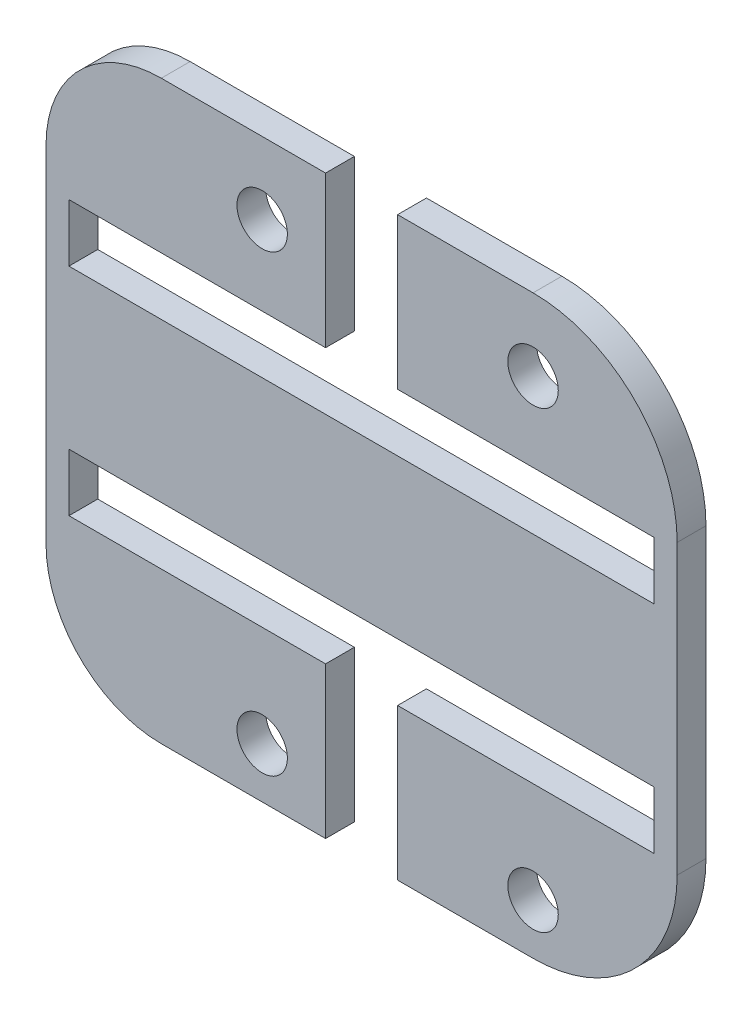
ISO-10303-21;
HEADER;
FILE_DESCRIPTION(('STEP AP214'),'2;1');
FILE_NAME('part.step','',(''),(''),'','','');
FILE_SCHEMA(('AUTOMOTIVE_DESIGN { 1 0 10303 214 1 1 1 1 }'));
ENDSEC;
DATA;
#1=APPLICATION_CONTEXT('core data for automotive mechanical design processes');
#2=APPLICATION_PROTOCOL_DEFINITION('international standard','automotive_design',2000,#1);
#3=PRODUCT_CONTEXT('',#1,'mechanical');
#4=PRODUCT('Part','Part','',(#3));
#5=PRODUCT_RELATED_PRODUCT_CATEGORY('part','',(#4));
#6=PRODUCT_DEFINITION_FORMATION('','',#4);
#7=PRODUCT_DEFINITION_CONTEXT('part definition',#1,'design');
#8=PRODUCT_DEFINITION('design','',#6,#7);
#9=PRODUCT_DEFINITION_SHAPE('','',#8);
#10=(LENGTH_UNIT() NAMED_UNIT(*) SI_UNIT(.MILLI.,.METRE.));
#11=(NAMED_UNIT(*) PLANE_ANGLE_UNIT() SI_UNIT($,.RADIAN.));
#12=(NAMED_UNIT(*) SI_UNIT($,.STERADIAN.) SOLID_ANGLE_UNIT());
#13=UNCERTAINTY_MEASURE_WITH_UNIT(LENGTH_MEASURE(1.E-05),#10,'distance_accuracy_value','');
#14=(GEOMETRIC_REPRESENTATION_CONTEXT(3) GLOBAL_UNCERTAINTY_ASSIGNED_CONTEXT((#13)) GLOBAL_UNIT_ASSIGNED_CONTEXT((#10,
#11,#12)) REPRESENTATION_CONTEXT('',''));
#15=CARTESIAN_POINT('',(0.,0.,0.));
#16=DIRECTION('',(0.,0.,1.));
#17=DIRECTION('',(1.,0.,0.));
#18=AXIS2_PLACEMENT_3D('',#15,#16,#17);
#19=CARTESIAN_POINT('',(0.,10.5,2.));
#20=DIRECTION('',(0.,1.,0.));
#21=DIRECTION('',(-1.,0.,0.));
#22=AXIS2_PLACEMENT_3D('',#19,#20,#21);
#23=PLANE('',#22);
#24=DIRECTION('',(1.,0.,0.));
#25=VECTOR('',#24,1.);
#26=CARTESIAN_POINT('',(0.,10.5,0.));
#27=LINE('',#26,#25);
#28=CARTESIAN_POINT('',(1.59,10.5,0.));
#29=VERTEX_POINT('',#28);
#30=CARTESIAN_POINT('',(19.4000000000001,10.5000000000001,0.));
#31=VERTEX_POINT('',#30);
#32=EDGE_CURVE('E201',#29,#31,#27,.T.);
#33=ORIENTED_EDGE('',*,*,#32,.F.);
#34=DIRECTION('',(0.,0.,-1.));
#35=VECTOR('',#34,1.);
#36=CARTESIAN_POINT('',(1.59,10.5,2.));
#37=LINE('',#36,#35);
#38=CARTESIAN_POINT('',(1.59,10.5,2.));
#39=VERTEX_POINT('',#38);
#40=EDGE_CURVE('E196',#39,#29,#37,.T.);
#41=ORIENTED_EDGE('',*,*,#40,.F.);
#42=DIRECTION('',(1.,0.,0.));
#43=VECTOR('',#42,1.);
#44=CARTESIAN_POINT('',(0.,10.5,2.));
#45=LINE('',#44,#43);
#46=CARTESIAN_POINT('',(19.4000000000001,10.5000000000001,2.));
#47=VERTEX_POINT('',#46);
#48=EDGE_CURVE('E199',#39,#47,#45,.T.);
#49=ORIENTED_EDGE('',*,*,#48,.T.);
#50=DIRECTION('',(0.,0.,-1.));
#51=VECTOR('',#50,1.);
#52=CARTESIAN_POINT('',(19.4000000000001,10.5000000000001,2.));
#53=LINE('',#52,#51);
#54=EDGE_CURVE('E269',#47,#31,#53,.T.);
#55=ORIENTED_EDGE('',*,*,#54,.T.);
#56=EDGE_LOOP('',(#33,#41,#49,#55));
#57=FACE_BOUND('',#56,.T.);
#58=ADVANCED_FACE('F35',(#57),#23,.T.);
#59=CARTESIAN_POINT('',(1.59,0.,2.));
#60=DIRECTION('',(-1.,0.,0.));
#61=DIRECTION('',(0.,-1.,0.));
#62=AXIS2_PLACEMENT_3D('',#59,#60,#61);
#63=PLANE('',#62);
#64=DIRECTION('',(0.,1.,0.));
#65=VECTOR('',#64,1.);
#66=CARTESIAN_POINT('',(1.59,0.,0.));
#67=LINE('',#66,#65);
#68=CARTESIAN_POINT('',(1.59,14.5,0.));
#69=VERTEX_POINT('',#68);
#70=EDGE_CURVE('E271',#29,#69,#67,.T.);
#71=ORIENTED_EDGE('',*,*,#70,.T.);
#72=DIRECTION('',(0.,0.,-1.));
#73=VECTOR('',#72,1.);
#74=CARTESIAN_POINT('',(1.59,14.5,2.));
#75=LINE('',#74,#73);
#76=CARTESIAN_POINT('',(1.59,14.5,2.));
#77=VERTEX_POINT('',#76);
#78=EDGE_CURVE('E205',#77,#69,#75,.T.);
#79=ORIENTED_EDGE('',*,*,#78,.F.);
#80=DIRECTION('',(0.,1.,0.));
#81=VECTOR('',#80,1.);
#82=CARTESIAN_POINT('',(1.59,0.,2.));
#83=LINE('',#82,#81);
#84=EDGE_CURVE('E208',#39,#77,#83,.T.);
#85=ORIENTED_EDGE('',*,*,#84,.F.);
#86=ORIENTED_EDGE('',*,*,#40,.T.);
#87=EDGE_LOOP('',(#71,#79,#85,#86));
#88=FACE_BOUND('',#87,.T.);
#89=ADVANCED_FACE('F209',(#88),#63,.F.);
#90=CARTESIAN_POINT('',(0.,14.5,2.));
#91=DIRECTION('',(0.,1.,0.));
#92=DIRECTION('',(0.,0.,1.));
#93=AXIS2_PLACEMENT_3D('',#90,#91,#92);
#94=PLANE('',#93);
#95=DIRECTION('',(1.,0.,0.));
#96=VECTOR('',#95,1.);
#97=CARTESIAN_POINT('',(0.,14.5,0.));
#98=LINE('',#97,#96);
#99=CARTESIAN_POINT('',(42.21,14.5,0.));
#100=VERTEX_POINT('',#99);
#101=EDGE_CURVE('E274',#69,#100,#98,.T.);
#102=ORIENTED_EDGE('',*,*,#101,.T.);
#103=DIRECTION('',(0.,0.,-1.));
#104=VECTOR('',#103,1.);
#105=CARTESIAN_POINT('',(42.21,14.5,2.));
#106=LINE('',#105,#104);
#107=CARTESIAN_POINT('',(42.21,14.5,2.));
#108=VERTEX_POINT('',#107);
#109=EDGE_CURVE('E347',#108,#100,#106,.T.);
#110=ORIENTED_EDGE('',*,*,#109,.F.);
#111=DIRECTION('',(1.,0.,0.));
#112=VECTOR('',#111,1.);
#113=CARTESIAN_POINT('',(0.,14.5,2.));
#114=LINE('',#113,#112);
#115=EDGE_CURVE('E212',#77,#108,#114,.T.);
#116=ORIENTED_EDGE('',*,*,#115,.F.);
#117=ORIENTED_EDGE('',*,*,#78,.T.);
#118=EDGE_LOOP('',(#102,#110,#116,#117));
#119=FACE_BOUND('',#118,.T.);
#120=ADVANCED_FACE('F466',(#119),#94,.F.);
#121=CARTESIAN_POINT('',(42.21,0.,2.));
#122=DIRECTION('',(-1.,0.,0.));
#123=DIRECTION('',(0.,0.,1.));
#124=AXIS2_PLACEMENT_3D('',#121,#122,#123);
#125=PLANE('',#124);
#126=DIRECTION('',(0.,1.,0.));
#127=VECTOR('',#126,1.);
#128=CARTESIAN_POINT('',(42.21,0.,0.));
#129=LINE('',#128,#127);
#130=CARTESIAN_POINT('',(42.21,10.5,0.));
#131=VERTEX_POINT('',#130);
#132=EDGE_CURVE('E277',#131,#100,#129,.T.);
#133=ORIENTED_EDGE('',*,*,#132,.F.);
#134=DIRECTION('',(0.,0.,-1.));
#135=VECTOR('',#134,1.);
#136=CARTESIAN_POINT('',(42.21,10.5,2.));
#137=LINE('',#136,#135);
#138=CARTESIAN_POINT('',(42.21,10.5,2.));
#139=VERTEX_POINT('',#138);
#140=EDGE_CURVE('E345',#139,#131,#137,.T.);
#141=ORIENTED_EDGE('',*,*,#140,.F.);
#142=DIRECTION('',(0.,1.,0.));
#143=VECTOR('',#142,1.);
#144=CARTESIAN_POINT('',(42.21,0.,2.));
#145=LINE('',#144,#143);
#146=EDGE_CURVE('E228',#139,#108,#145,.T.);
#147=ORIENTED_EDGE('',*,*,#146,.T.);
#148=ORIENTED_EDGE('',*,*,#109,.T.);
#149=EDGE_LOOP('',(#133,#141,#147,#148));
#150=FACE_BOUND('',#149,.T.);
#151=ADVANCED_FACE('F463',(#150),#125,.T.);
#152=CARTESIAN_POINT('',(0.,10.5000000000001,2.));
#153=DIRECTION('',(0.,1.,0.));
#154=DIRECTION('',(-1.,0.,0.));
#155=AXIS2_PLACEMENT_3D('',#152,#153,#154);
#156=PLANE('',#155);
#157=DIRECTION('',(1.,0.,0.));
#158=VECTOR('',#157,1.);
#159=CARTESIAN_POINT('',(0.,10.5000000000001,0.));
#160=LINE('',#159,#158);
#161=CARTESIAN_POINT('',(24.4000000000001,10.5000000000001,0.));
#162=VERTEX_POINT('',#161);
#163=EDGE_CURVE('E280',#162,#131,#160,.T.);
#164=ORIENTED_EDGE('',*,*,#163,.F.);
#165=DIRECTION('',(0.,0.,-1.));
#166=VECTOR('',#165,1.);
#167=CARTESIAN_POINT('',(24.4000000000001,10.5000000000001,2.));
#168=LINE('',#167,#166);
#169=CARTESIAN_POINT('',(24.4000000000001,10.5000000000001,2.));
#170=VERTEX_POINT('',#169);
#171=EDGE_CURVE('E343',#170,#162,#168,.T.);
#172=ORIENTED_EDGE('',*,*,#171,.F.);
#173=DIRECTION('',(1.,0.,0.));
#174=VECTOR('',#173,1.);
#175=CARTESIAN_POINT('',(0.,10.5000000000001,2.));
#176=LINE('',#175,#174);
#177=EDGE_CURVE('E231',#170,#139,#176,.T.);
#178=ORIENTED_EDGE('',*,*,#177,.T.);
#179=ORIENTED_EDGE('',*,*,#140,.T.);
#180=EDGE_LOOP('',(#164,#172,#178,#179));
#181=FACE_BOUND('',#180,.T.);
#182=ADVANCED_FACE('F459',(#181),#156,.T.);
#183=CARTESIAN_POINT('',(24.4000000000001,0.,2.));
#184=DIRECTION('',(-1.,0.,0.));
#185=DIRECTION('',(0.,-1.,0.));
#186=AXIS2_PLACEMENT_3D('',#183,#184,#185);
#187=PLANE('',#186);
#188=DIRECTION('',(0.,1.,0.));
#189=VECTOR('',#188,1.);
#190=CARTESIAN_POINT('',(24.4000000000001,0.,0.));
#191=LINE('',#190,#189);
#192=CARTESIAN_POINT('',(24.4000000000001,0.,0.));
#193=VERTEX_POINT('',#192);
#194=EDGE_CURVE('E283',#193,#162,#191,.T.);
#195=ORIENTED_EDGE('',*,*,#194,.F.);
#196=DIRECTION('',(0.,0.,-1.));
#197=VECTOR('',#196,1.);
#198=CARTESIAN_POINT('',(24.4000000000001,0.,2.));
#199=LINE('',#198,#197);
#200=CARTESIAN_POINT('',(24.4000000000001,0.,2.));
#201=VERTEX_POINT('',#200);
#202=EDGE_CURVE('E341',#201,#193,#199,.T.);
#203=ORIENTED_EDGE('',*,*,#202,.F.);
#204=DIRECTION('',(0.,1.,0.));
#205=VECTOR('',#204,1.);
#206=CARTESIAN_POINT('',(24.4000000000001,0.,2.));
#207=LINE('',#206,#205);
#208=EDGE_CURVE('E234',#201,#170,#207,.T.);
#209=ORIENTED_EDGE('',*,*,#208,.T.);
#210=ORIENTED_EDGE('',*,*,#171,.T.);
#211=EDGE_LOOP('',(#195,#203,#209,#210));
#212=FACE_BOUND('',#211,.T.);
#213=ADVANCED_FACE('F454',(#212),#187,.T.);
#214=CARTESIAN_POINT('',(0.,0.,2.));
#215=DIRECTION('',(0.,1.,0.));
#216=DIRECTION('',(0.,0.,1.));
#217=AXIS2_PLACEMENT_3D('',#214,#215,#216);
#218=PLANE('',#217);
#219=DIRECTION('',(1.,0.,0.));
#220=VECTOR('',#219,1.);
#221=CARTESIAN_POINT('',(0.,0.,0.));
#222=LINE('',#221,#220);
#223=CARTESIAN_POINT('',(33.8,0.,0.));
#224=VERTEX_POINT('',#223);
#225=EDGE_CURVE('E286',#193,#224,#222,.T.);
#226=ORIENTED_EDGE('',*,*,#225,.T.);
#227=DIRECTION('',(0.,0.,-1.));
#228=VECTOR('',#227,1.);
#229=CARTESIAN_POINT('',(33.8,0.,2.));
#230=LINE('',#229,#228);
#231=CARTESIAN_POINT('',(33.8,0.,2.));
#232=VERTEX_POINT('',#231);
#233=EDGE_CURVE('E365',#224,#232,#230,.F.);
#234=ORIENTED_EDGE('',*,*,#233,.T.);
#235=DIRECTION('',(1.,0.,0.));
#236=VECTOR('',#235,1.);
#237=CARTESIAN_POINT('',(0.,0.,2.));
#238=LINE('',#237,#236);
#239=EDGE_CURVE('E237',#201,#232,#238,.T.);
#240=ORIENTED_EDGE('',*,*,#239,.F.);
#241=ORIENTED_EDGE('',*,*,#202,.T.);
#242=EDGE_LOOP('',(#226,#234,#240,#241));
#243=FACE_BOUND('',#242,.T.);
#244=ADVANCED_FACE('F452',(#243),#218,.F.);
#245=CARTESIAN_POINT('',(43.8,0.,2.));
#246=DIRECTION('',(-1.,0.,0.));
#247=DIRECTION('',(0.,-1.,0.));
#248=AXIS2_PLACEMENT_3D('',#245,#246,#247);
#249=PLANE('',#248);
#250=DIRECTION('',(0.,1.,0.));
#251=VECTOR('',#250,1.);
#252=CARTESIAN_POINT('',(43.8,0.,0.));
#253=LINE('',#252,#251);
#254=CARTESIAN_POINT('',(43.8,10.,0.));
#255=VERTEX_POINT('',#254);
#256=CARTESIAN_POINT('',(43.8,30.,0.));
#257=VERTEX_POINT('',#256);
#258=EDGE_CURVE('E289',#255,#257,#253,.T.);
#259=ORIENTED_EDGE('',*,*,#258,.T.);
#260=DIRECTION('',(0.,0.,-1.));
#261=VECTOR('',#260,1.);
#262=CARTESIAN_POINT('',(43.8,30.,2.));
#263=LINE('',#262,#261);
#264=CARTESIAN_POINT('',(43.8,30.,2.));
#265=VERTEX_POINT('',#264);
#266=EDGE_CURVE('E359',#257,#265,#263,.F.);
#267=ORIENTED_EDGE('',*,*,#266,.T.);
#268=DIRECTION('',(0.,1.,0.));
#269=VECTOR('',#268,1.);
#270=CARTESIAN_POINT('',(43.8,0.,2.));
#271=LINE('',#270,#269);
#272=CARTESIAN_POINT('',(43.8,10.,2.));
#273=VERTEX_POINT('',#272);
#274=EDGE_CURVE('E240',#273,#265,#271,.T.);
#275=ORIENTED_EDGE('',*,*,#274,.F.);
#276=DIRECTION('',(0.,0.,-1.));
#277=VECTOR('',#276,1.);
#278=CARTESIAN_POINT('',(43.8,10.,2.));
#279=LINE('',#278,#277);
#280=EDGE_CURVE('E356',#273,#255,#279,.T.);
#281=ORIENTED_EDGE('',*,*,#280,.T.);
#282=EDGE_LOOP('',(#259,#267,#275,#281));
#283=FACE_BOUND('',#282,.T.);
#284=ADVANCED_FACE('F441',(#283),#249,.F.);
#285=CARTESIAN_POINT('',(0.,40.,2.));
#286=DIRECTION('',(0.,1.,0.));
#287=DIRECTION('',(-1.,0.,0.));
#288=AXIS2_PLACEMENT_3D('',#285,#286,#287);
#289=PLANE('',#288);
#290=DIRECTION('',(1.,0.,0.));
#291=VECTOR('',#290,1.);
#292=CARTESIAN_POINT('',(0.,40.,2.));
#293=LINE('',#292,#291);
#294=CARTESIAN_POINT('',(24.4000000000001,40.,2.));
#295=VERTEX_POINT('',#294);
#296=CARTESIAN_POINT('',(33.8,40.,2.));
#297=VERTEX_POINT('',#296);
#298=EDGE_CURVE('E244',#295,#297,#293,.T.);
#299=ORIENTED_EDGE('',*,*,#298,.T.);
#300=DIRECTION('',(0.,0.,-1.));
#301=VECTOR('',#300,1.);
#302=CARTESIAN_POINT('',(33.8,40.,0.));
#303=LINE('',#302,#301);
#304=CARTESIAN_POINT('',(33.8,40.,0.));
#305=VERTEX_POINT('',#304);
#306=EDGE_CURVE('E204',#297,#305,#303,.T.);
#307=ORIENTED_EDGE('',*,*,#306,.T.);
#308=DIRECTION('',(1.,0.,0.));
#309=VECTOR('',#308,1.);
#310=CARTESIAN_POINT('',(0.,40.,0.));
#311=LINE('',#310,#309);
#312=CARTESIAN_POINT('',(24.4000000000001,40.,0.));
#313=VERTEX_POINT('',#312);
#314=EDGE_CURVE('E292',#313,#305,#311,.T.);
#315=ORIENTED_EDGE('',*,*,#314,.F.);
#316=DIRECTION('',(0.,0.,-1.));
#317=VECTOR('',#316,1.);
#318=CARTESIAN_POINT('',(24.4000000000001,40.,2.));
#319=LINE('',#318,#317);
#320=EDGE_CURVE('E339',#295,#313,#319,.T.);
#321=ORIENTED_EDGE('',*,*,#320,.F.);
#322=EDGE_LOOP('',(#299,#307,#315,#321));
#323=FACE_BOUND('',#322,.T.);
#324=ADVANCED_FACE('F432',(#323),#289,.T.);
#325=CARTESIAN_POINT('',(24.4000000000001,0.,2.));
#326=DIRECTION('',(-1.,0.,0.));
#327=DIRECTION('',(0.,-1.,0.));
#328=AXIS2_PLACEMENT_3D('',#325,#326,#327);
#329=PLANE('',#328);
#330=DIRECTION('',(0.,1.,0.));
#331=VECTOR('',#330,1.);
#332=CARTESIAN_POINT('',(24.4000000000001,0.,0.));
#333=LINE('',#332,#331);
#334=CARTESIAN_POINT('',(24.4000000000001,29.5000000000001,0.));
#335=VERTEX_POINT('',#334);
#336=EDGE_CURVE('E295',#335,#313,#333,.T.);
#337=ORIENTED_EDGE('',*,*,#336,.F.);
#338=DIRECTION('',(0.,0.,-1.));
#339=VECTOR('',#338,1.);
#340=CARTESIAN_POINT('',(24.4000000000001,29.5000000000001,2.));
#341=LINE('',#340,#339);
#342=CARTESIAN_POINT('',(24.4000000000001,29.5000000000001,2.));
#343=VERTEX_POINT('',#342);
#344=EDGE_CURVE('E337',#343,#335,#341,.T.);
#345=ORIENTED_EDGE('',*,*,#344,.F.);
#346=DIRECTION('',(0.,1.,0.));
#347=VECTOR('',#346,1.);
#348=CARTESIAN_POINT('',(24.4000000000001,0.,2.));
#349=LINE('',#348,#347);
#350=EDGE_CURVE('E247',#343,#295,#349,.T.);
#351=ORIENTED_EDGE('',*,*,#350,.T.);
#352=ORIENTED_EDGE('',*,*,#320,.T.);
#353=EDGE_LOOP('',(#337,#345,#351,#352));
#354=FACE_BOUND('',#353,.T.);
#355=ADVANCED_FACE('F428',(#354),#329,.T.);
#356=CARTESIAN_POINT('',(0.,29.5000000000001,2.));
#357=DIRECTION('',(0.,1.,0.));
#358=DIRECTION('',(-1.,0.,0.));
#359=AXIS2_PLACEMENT_3D('',#356,#357,#358);
#360=PLANE('',#359);
#361=DIRECTION('',(1.,0.,0.));
#362=VECTOR('',#361,1.);
#363=CARTESIAN_POINT('',(0.,29.5000000000001,0.));
#364=LINE('',#363,#362);
#365=CARTESIAN_POINT('',(42.21,29.5,0.));
#366=VERTEX_POINT('',#365);
#367=EDGE_CURVE('E299',#335,#366,#364,.T.);
#368=ORIENTED_EDGE('',*,*,#367,.T.);
#369=DIRECTION('',(0.,0.,-1.));
#370=VECTOR('',#369,1.);
#371=CARTESIAN_POINT('',(42.21,29.5,2.));
#372=LINE('',#371,#370);
#373=CARTESIAN_POINT('',(42.21,29.5,2.));
#374=VERTEX_POINT('',#373);
#375=EDGE_CURVE('E334',#374,#366,#372,.T.);
#376=ORIENTED_EDGE('',*,*,#375,.F.);
#377=DIRECTION('',(1.,0.,0.));
#378=VECTOR('',#377,1.);
#379=CARTESIAN_POINT('',(0.,29.5000000000001,2.));
#380=LINE('',#379,#378);
#381=EDGE_CURVE('E251',#343,#374,#380,.T.);
#382=ORIENTED_EDGE('',*,*,#381,.F.);
#383=ORIENTED_EDGE('',*,*,#344,.T.);
#384=EDGE_LOOP('',(#368,#376,#382,#383));
#385=FACE_BOUND('',#384,.T.);
#386=ADVANCED_FACE('F425',(#385),#360,.F.);
#387=CARTESIAN_POINT('',(42.21,0.,2.));
#388=DIRECTION('',(1.,0.,0.));
#389=DIRECTION('',(0.,0.,-1.));
#390=AXIS2_PLACEMENT_3D('',#387,#388,#389);
#391=PLANE('',#390);
#392=DIRECTION('',(0.,-1.,0.));
#393=VECTOR('',#392,1.);
#394=CARTESIAN_POINT('',(42.21,0.,0.));
#395=LINE('',#394,#393);
#396=CARTESIAN_POINT('',(42.21,25.5,0.));
#397=VERTEX_POINT('',#396);
#398=EDGE_CURVE('E301',#366,#397,#395,.T.);
#399=ORIENTED_EDGE('',*,*,#398,.T.);
#400=DIRECTION('',(0.,0.,-1.));
#401=VECTOR('',#400,1.);
#402=CARTESIAN_POINT('',(42.21,25.5,2.));
#403=LINE('',#402,#401);
#404=CARTESIAN_POINT('',(42.21,25.5,2.));
#405=VERTEX_POINT('',#404);
#406=EDGE_CURVE('E332',#405,#397,#403,.T.);
#407=ORIENTED_EDGE('',*,*,#406,.F.);
#408=DIRECTION('',(0.,-1.,0.));
#409=VECTOR('',#408,1.);
#410=CARTESIAN_POINT('',(42.21,0.,2.));
#411=LINE('',#410,#409);
#412=EDGE_CURVE('E253',#374,#405,#411,.T.);
#413=ORIENTED_EDGE('',*,*,#412,.F.);
#414=ORIENTED_EDGE('',*,*,#375,.T.);
#415=EDGE_LOOP('',(#399,#407,#413,#414));
#416=FACE_BOUND('',#415,.T.);
#417=ADVANCED_FACE('F420',(#416),#391,.F.);
#418=CARTESIAN_POINT('',(0.,25.5,2.));
#419=DIRECTION('',(0.,1.,0.));
#420=DIRECTION('',(0.,0.,1.));
#421=AXIS2_PLACEMENT_3D('',#418,#419,#420);
#422=PLANE('',#421);
#423=DIRECTION('',(1.,0.,0.));
#424=VECTOR('',#423,1.);
#425=CARTESIAN_POINT('',(0.,25.5,0.));
#426=LINE('',#425,#424);
#427=CARTESIAN_POINT('',(1.59,25.5,0.));
#428=VERTEX_POINT('',#427);
#429=EDGE_CURVE('E304',#428,#397,#426,.T.);
#430=ORIENTED_EDGE('',*,*,#429,.F.);
#431=DIRECTION('',(0.,0.,-1.));
#432=VECTOR('',#431,1.);
#433=CARTESIAN_POINT('',(1.59,25.5,2.));
#434=LINE('',#433,#432);
#435=CARTESIAN_POINT('',(1.59,25.5,2.));
#436=VERTEX_POINT('',#435);
#437=EDGE_CURVE('E330',#436,#428,#434,.T.);
#438=ORIENTED_EDGE('',*,*,#437,.F.);
#439=DIRECTION('',(1.,0.,0.));
#440=VECTOR('',#439,1.);
#441=CARTESIAN_POINT('',(0.,25.5,2.));
#442=LINE('',#441,#440);
#443=EDGE_CURVE('E255',#436,#405,#442,.T.);
#444=ORIENTED_EDGE('',*,*,#443,.T.);
#445=ORIENTED_EDGE('',*,*,#406,.T.);
#446=EDGE_LOOP('',(#430,#438,#444,#445));
#447=FACE_BOUND('',#446,.T.);
#448=ADVANCED_FACE('F414',(#447),#422,.T.);
#449=CARTESIAN_POINT('',(1.59,0.,2.));
#450=DIRECTION('',(1.,0.,0.));
#451=DIRECTION('',(0.,1.,0.));
#452=AXIS2_PLACEMENT_3D('',#449,#450,#451);
#453=PLANE('',#452);
#454=DIRECTION('',(0.,-1.,0.));
#455=VECTOR('',#454,1.);
#456=CARTESIAN_POINT('',(1.59,0.,0.));
#457=LINE('',#456,#455);
#458=CARTESIAN_POINT('',(1.59,29.5,0.));
#459=VERTEX_POINT('',#458);
#460=EDGE_CURVE('E307',#459,#428,#457,.T.);
#461=ORIENTED_EDGE('',*,*,#460,.F.);
#462=DIRECTION('',(0.,0.,-1.));
#463=VECTOR('',#462,1.);
#464=CARTESIAN_POINT('',(1.59,29.5,2.));
#465=LINE('',#464,#463);
#466=CARTESIAN_POINT('',(1.59,29.5,2.));
#467=VERTEX_POINT('',#466);
#468=EDGE_CURVE('E328',#467,#459,#465,.T.);
#469=ORIENTED_EDGE('',*,*,#468,.F.);
#470=DIRECTION('',(0.,-1.,0.));
#471=VECTOR('',#470,1.);
#472=CARTESIAN_POINT('',(1.59,0.,2.));
#473=LINE('',#472,#471);
#474=EDGE_CURVE('E258',#467,#436,#473,.T.);
#475=ORIENTED_EDGE('',*,*,#474,.T.);
#476=ORIENTED_EDGE('',*,*,#437,.T.);
#477=EDGE_LOOP('',(#461,#469,#475,#476));
#478=FACE_BOUND('',#477,.T.);
#479=ADVANCED_FACE('F408',(#478),#453,.T.);
#480=CARTESIAN_POINT('',(0.,29.5,2.));
#481=DIRECTION('',(0.,1.,0.));
#482=DIRECTION('',(-1.,0.,0.));
#483=AXIS2_PLACEMENT_3D('',#480,#481,#482);
#484=PLANE('',#483);
#485=DIRECTION('',(1.,0.,0.));
#486=VECTOR('',#485,1.);
#487=CARTESIAN_POINT('',(0.,29.5,0.));
#488=LINE('',#487,#486);
#489=CARTESIAN_POINT('',(19.4000000000001,29.5000000000001,0.));
#490=VERTEX_POINT('',#489);
#491=EDGE_CURVE('E310',#459,#490,#488,.T.);
#492=ORIENTED_EDGE('',*,*,#491,.T.);
#493=DIRECTION('',(0.,0.,-1.));
#494=VECTOR('',#493,1.);
#495=CARTESIAN_POINT('',(19.4000000000001,29.5000000000001,2.));
#496=LINE('',#495,#494);
#497=CARTESIAN_POINT('',(19.4000000000001,29.5000000000001,2.));
#498=VERTEX_POINT('',#497);
#499=EDGE_CURVE('E325',#498,#490,#496,.T.);
#500=ORIENTED_EDGE('',*,*,#499,.F.);
#501=DIRECTION('',(1.,0.,0.));
#502=VECTOR('',#501,1.);
#503=CARTESIAN_POINT('',(0.,29.5,2.));
#504=LINE('',#503,#502);
#505=EDGE_CURVE('E261',#467,#498,#504,.T.);
#506=ORIENTED_EDGE('',*,*,#505,.F.);
#507=ORIENTED_EDGE('',*,*,#468,.T.);
#508=EDGE_LOOP('',(#492,#500,#506,#507));
#509=FACE_BOUND('',#508,.T.);
#510=ADVANCED_FACE('F628',(#509),#484,.F.);
#511=CARTESIAN_POINT('',(19.4000000000001,0.,2.));
#512=DIRECTION('',(-1.,0.,0.));
#513=DIRECTION('',(0.,-1.,0.));
#514=AXIS2_PLACEMENT_3D('',#511,#512,#513);
#515=PLANE('',#514);
#516=DIRECTION('',(0.,1.,0.));
#517=VECTOR('',#516,1.);
#518=CARTESIAN_POINT('',(19.4000000000001,0.,0.));
#519=LINE('',#518,#517);
#520=CARTESIAN_POINT('',(19.4000000000001,40.,0.));
#521=VERTEX_POINT('',#520);
#522=EDGE_CURVE('E312',#490,#521,#519,.T.);
#523=ORIENTED_EDGE('',*,*,#522,.T.);
#524=DIRECTION('',(0.,0.,-1.));
#525=VECTOR('',#524,1.);
#526=CARTESIAN_POINT('',(19.4000000000001,40.,2.));
#527=LINE('',#526,#525);
#528=CARTESIAN_POINT('',(19.4000000000001,40.,2.));
#529=VERTEX_POINT('',#528);
#530=EDGE_CURVE('E322',#529,#521,#527,.T.);
#531=ORIENTED_EDGE('',*,*,#530,.F.);
#532=DIRECTION('',(0.,1.,0.));
#533=VECTOR('',#532,1.);
#534=CARTESIAN_POINT('',(19.4000000000001,0.,2.));
#535=LINE('',#534,#533);
#536=EDGE_CURVE('E263',#498,#529,#535,.T.);
#537=ORIENTED_EDGE('',*,*,#536,.F.);
#538=ORIENTED_EDGE('',*,*,#499,.T.);
#539=EDGE_LOOP('',(#523,#531,#537,#538));
#540=FACE_BOUND('',#539,.T.);
#541=ADVANCED_FACE('F402',(#540),#515,.F.);
#542=CARTESIAN_POINT('',(8.,40.,0.));
#543=VERTEX_POINT('',#542);
#544=EDGE_CURVE('E296',#543,#521,#311,.T.);
#545=ORIENTED_EDGE('',*,*,#544,.F.);
#546=DIRECTION('',(0.,0.,-1.));
#547=VECTOR('',#546,1.);
#548=CARTESIAN_POINT('',(8.,40.,2.));
#549=LINE('',#548,#547);
#550=CARTESIAN_POINT('',(8.,40.,2.));
#551=VERTEX_POINT('',#550);
#552=EDGE_CURVE('E11',#543,#551,#549,.F.);
#553=ORIENTED_EDGE('',*,*,#552,.T.);
#554=EDGE_CURVE('E248',#551,#529,#293,.T.);
#555=ORIENTED_EDGE('',*,*,#554,.T.);
#556=ORIENTED_EDGE('',*,*,#530,.T.);
#557=EDGE_LOOP('',(#545,#553,#555,#556));
#558=FACE_BOUND('',#557,.T.);
#559=ADVANCED_FACE('F398',(#558),#289,.T.);
#560=CARTESIAN_POINT('',(0.,0.,2.));
#561=DIRECTION('',(-1.,0.,0.));
#562=DIRECTION('',(0.,0.,1.));
#563=AXIS2_PLACEMENT_3D('',#560,#561,#562);
#564=PLANE('',#563);
#565=DIRECTION('',(0.,1.,0.));
#566=VECTOR('',#565,1.);
#567=CARTESIAN_POINT('',(0.,0.,0.));
#568=LINE('',#567,#566);
#569=CARTESIAN_POINT('',(0.,8.,0.));
#570=VERTEX_POINT('',#569);
#571=CARTESIAN_POINT('',(0.,32.,0.));
#572=VERTEX_POINT('',#571);
#573=EDGE_CURVE('E315',#570,#572,#568,.T.);
#574=ORIENTED_EDGE('',*,*,#573,.F.);
#575=DIRECTION('',(0.,0.,-1.));
#576=VECTOR('',#575,1.);
#577=CARTESIAN_POINT('',(0.,8.,2.));
#578=LINE('',#577,#576);
#579=CARTESIAN_POINT('',(0.,8.,2.));
#580=VERTEX_POINT('',#579);
#581=EDGE_CURVE('E377',#570,#580,#578,.F.);
#582=ORIENTED_EDGE('',*,*,#581,.T.);
#583=DIRECTION('',(0.,1.,0.));
#584=VECTOR('',#583,1.);
#585=CARTESIAN_POINT('',(0.,0.,2.));
#586=LINE('',#585,#584);
#587=CARTESIAN_POINT('',(0.,32.,2.));
#588=VERTEX_POINT('',#587);
#589=EDGE_CURVE('E266',#580,#588,#586,.T.);
#590=ORIENTED_EDGE('',*,*,#589,.T.);
#591=DIRECTION('',(0.,0.,-1.));
#592=VECTOR('',#591,1.);
#593=CARTESIAN_POINT('',(0.,32.,2.));
#594=LINE('',#593,#592);
#595=EDGE_CURVE('E374',#588,#572,#594,.T.);
#596=ORIENTED_EDGE('',*,*,#595,.T.);
#597=EDGE_LOOP('',(#574,#582,#590,#596));
#598=FACE_BOUND('',#597,.T.);
#599=ADVANCED_FACE('F394',(#598),#564,.T.);
#600=CARTESIAN_POINT('',(8.,0.,2.));
#601=VERTEX_POINT('',#600);
#602=CARTESIAN_POINT('',(19.4000000000001,0.,2.));
#603=VERTEX_POINT('',#602);
#604=EDGE_CURVE('E241',#601,#603,#238,.T.);
#605=ORIENTED_EDGE('',*,*,#604,.F.);
#606=DIRECTION('',(0.,0.,-1.));
#607=VECTOR('',#606,1.);
#608=CARTESIAN_POINT('',(8.,0.,0.));
#609=LINE('',#608,#607);
#610=CARTESIAN_POINT('',(8.,0.,0.));
#611=VERTEX_POINT('',#610);
#612=EDGE_CURVE('E367',#601,#611,#609,.T.);
#613=ORIENTED_EDGE('',*,*,#612,.T.);
#614=CARTESIAN_POINT('',(19.4000000000001,0.,0.));
#615=VERTEX_POINT('',#614);
#616=EDGE_CURVE('E221',#611,#615,#222,.T.);
#617=ORIENTED_EDGE('',*,*,#616,.T.);
#618=DIRECTION('',(0.,0.,-1.));
#619=VECTOR('',#618,1.);
#620=CARTESIAN_POINT('',(19.4000000000001,0.,2.));
#621=LINE('',#620,#619);
#622=EDGE_CURVE('E319',#603,#615,#621,.T.);
#623=ORIENTED_EDGE('',*,*,#622,.F.);
#624=EDGE_LOOP('',(#605,#613,#617,#623));
#625=FACE_BOUND('',#624,.T.);
#626=ADVANCED_FACE('F386',(#625),#218,.F.);
#627=CARTESIAN_POINT('',(19.4000000000001,0.,2.));
#628=DIRECTION('',(-1.,0.,0.));
#629=DIRECTION('',(0.,-1.,0.));
#630=AXIS2_PLACEMENT_3D('',#627,#628,#629);
#631=PLANE('',#630);
#632=DIRECTION('',(0.,1.,0.));
#633=VECTOR('',#632,1.);
#634=CARTESIAN_POINT('',(19.4000000000001,0.,0.));
#635=LINE('',#634,#633);
#636=EDGE_CURVE('E218',#615,#31,#635,.T.);
#637=ORIENTED_EDGE('',*,*,#636,.T.);
#638=ORIENTED_EDGE('',*,*,#54,.F.);
#639=DIRECTION('',(0.,1.,0.));
#640=VECTOR('',#639,1.);
#641=CARTESIAN_POINT('',(19.4000000000001,0.,2.));
#642=LINE('',#641,#640);
#643=EDGE_CURVE('E216',#603,#47,#642,.T.);
#644=ORIENTED_EDGE('',*,*,#643,.F.);
#645=ORIENTED_EDGE('',*,*,#622,.T.);
#646=EDGE_LOOP('',(#637,#638,#644,#645));
#647=FACE_BOUND('',#646,.T.);
#648=ADVANCED_FACE('F468',(#647),#631,.F.);
#649=CARTESIAN_POINT('',(0.,0.,2.));
#650=DIRECTION('',(0.,0.,1.));
#651=DIRECTION('',(1.,0.,0.));
#652=AXIS2_PLACEMENT_3D('',#649,#650,#651);
#653=PLANE('',#652);
#654=CARTESIAN_POINT('',(33.8,35.,2.));
#655=DIRECTION('',(0.,0.,1.));
#656=DIRECTION('',(1.,0.,0.));
#657=AXIS2_PLACEMENT_3D('',#654,#655,#656);
#658=CIRCLE('',#657,1.75);
#659=CARTESIAN_POINT('',(35.55,35.,2.));
#660=VERTEX_POINT('',#659);
#661=EDGE_CURVE('E743',#660,#660,#658,.T.);
#662=ORIENTED_EDGE('',*,*,#661,.F.);
#663=EDGE_LOOP('',(#662));
#664=FACE_BOUND('',#663,.T.);
#665=CARTESIAN_POINT('',(33.8,3.5,2.));
#666=DIRECTION('',(0.,0.,1.));
#667=DIRECTION('',(1.,0.,0.));
#668=AXIS2_PLACEMENT_3D('',#665,#666,#667);
#669=CIRCLE('',#668,1.75);
#670=CARTESIAN_POINT('',(35.55,3.5,2.));
#671=VERTEX_POINT('',#670);
#672=EDGE_CURVE('E735',#671,#671,#669,.T.);
#673=ORIENTED_EDGE('',*,*,#672,.F.);
#674=EDGE_LOOP('',(#673));
#675=FACE_BOUND('',#674,.T.);
#676=CARTESIAN_POINT('',(15.,3.5,2.));
#677=DIRECTION('',(0.,0.,1.));
#678=DIRECTION('',(1.,0.,0.));
#679=AXIS2_PLACEMENT_3D('',#676,#677,#678);
#680=CIRCLE('',#679,1.75);
#681=CARTESIAN_POINT('',(16.75,3.5,2.));
#682=VERTEX_POINT('',#681);
#683=EDGE_CURVE('E728',#682,#682,#680,.T.);
#684=ORIENTED_EDGE('',*,*,#683,.F.);
#685=EDGE_LOOP('',(#684));
#686=FACE_BOUND('',#685,.T.);
#687=CARTESIAN_POINT('',(15.,35.,2.));
#688=DIRECTION('',(0.,0.,1.));
#689=DIRECTION('',(1.,0.,0.));
#690=AXIS2_PLACEMENT_3D('',#687,#688,#689);
#691=CIRCLE('',#690,1.75);
#692=CARTESIAN_POINT('',(16.75,35.,2.));
#693=VERTEX_POINT('',#692);
#694=EDGE_CURVE('E224',#693,#693,#691,.T.);
#695=ORIENTED_EDGE('',*,*,#694,.F.);
#696=EDGE_LOOP('',(#695));
#697=FACE_BOUND('',#696,.T.);
#698=ORIENTED_EDGE('',*,*,#589,.F.);
#699=CARTESIAN_POINT('',(8.,8.,2.));
#700=DIRECTION('',(0.,0.,1.));
#701=DIRECTION('',(1.,0.,0.));
#702=AXIS2_PLACEMENT_3D('',#699,#700,#701);
#703=CIRCLE('',#702,8.);
#704=EDGE_CURVE('E43',#580,#601,#703,.T.);
#705=ORIENTED_EDGE('',*,*,#704,.T.);
#706=ORIENTED_EDGE('',*,*,#604,.T.);
#707=ORIENTED_EDGE('',*,*,#643,.T.);
#708=ORIENTED_EDGE('',*,*,#48,.F.);
#709=ORIENTED_EDGE('',*,*,#84,.T.);
#710=ORIENTED_EDGE('',*,*,#115,.T.);
#711=ORIENTED_EDGE('',*,*,#146,.F.);
#712=ORIENTED_EDGE('',*,*,#177,.F.);
#713=ORIENTED_EDGE('',*,*,#208,.F.);
#714=ORIENTED_EDGE('',*,*,#239,.T.);
#715=CARTESIAN_POINT('',(33.8,10.,2.));
#716=DIRECTION('',(0.,0.,1.));
#717=DIRECTION('',(1.,0.,0.));
#718=AXIS2_PLACEMENT_3D('',#715,#716,#717);
#719=CIRCLE('',#718,10.);
#720=EDGE_CURVE('E361',#232,#273,#719,.T.);
#721=ORIENTED_EDGE('',*,*,#720,.T.);
#722=ORIENTED_EDGE('',*,*,#274,.T.);
#723=CARTESIAN_POINT('',(33.8,30.,2.));
#724=DIRECTION('',(0.,0.,1.));
#725=DIRECTION('',(1.,0.,0.));
#726=AXIS2_PLACEMENT_3D('',#723,#724,#725);
#727=CIRCLE('',#726,10.);
#728=EDGE_CURVE('E363',#265,#297,#727,.T.);
#729=ORIENTED_EDGE('',*,*,#728,.T.);
#730=ORIENTED_EDGE('',*,*,#298,.F.);
#731=ORIENTED_EDGE('',*,*,#350,.F.);
#732=ORIENTED_EDGE('',*,*,#381,.T.);
#733=ORIENTED_EDGE('',*,*,#412,.T.);
#734=ORIENTED_EDGE('',*,*,#443,.F.);
#735=ORIENTED_EDGE('',*,*,#474,.F.);
#736=ORIENTED_EDGE('',*,*,#505,.T.);
#737=ORIENTED_EDGE('',*,*,#536,.T.);
#738=ORIENTED_EDGE('',*,*,#554,.F.);
#739=CARTESIAN_POINT('',(8.,32.,2.));
#740=DIRECTION('',(0.,0.,1.));
#741=DIRECTION('',(1.,0.,0.));
#742=AXIS2_PLACEMENT_3D('',#739,#740,#741);
#743=CIRCLE('',#742,8.);
#744=EDGE_CURVE('E55',#551,#588,#743,.T.);
#745=ORIENTED_EDGE('',*,*,#744,.T.);
#746=EDGE_LOOP('',(#698,#705,#706,#707,#708,#709,#710,#711,#712,#713,#714,#721,#722,#729,#730,
#731,#732,#733,#734,#735,#736,#737,#738,#745));
#747=FACE_BOUND('',#746,.T.);
#748=ADVANCED_FACE('F214',(#664,#675,#686,#697,#747),#653,.T.);
#749=CARTESIAN_POINT('',(0.,0.,0.));
#750=DIRECTION('',(0.,0.,1.));
#751=DIRECTION('',(1.,0.,0.));
#752=AXIS2_PLACEMENT_3D('',#749,#750,#751);
#753=PLANE('',#752);
#754=CARTESIAN_POINT('',(33.8,35.,0.));
#755=DIRECTION('',(0.,0.,1.));
#756=DIRECTION('',(1.,0.,0.));
#757=AXIS2_PLACEMENT_3D('',#754,#755,#756);
#758=CIRCLE('',#757,1.75);
#759=CARTESIAN_POINT('',(35.55,35.,0.));
#760=VERTEX_POINT('',#759);
#761=EDGE_CURVE('E746',#760,#760,#758,.T.);
#762=ORIENTED_EDGE('',*,*,#761,.T.);
#763=EDGE_LOOP('',(#762));
#764=FACE_BOUND('',#763,.T.);
#765=CARTESIAN_POINT('',(33.8,3.5,0.));
#766=DIRECTION('',(0.,0.,1.));
#767=DIRECTION('',(1.,0.,0.));
#768=AXIS2_PLACEMENT_3D('',#765,#766,#767);
#769=CIRCLE('',#768,1.75);
#770=CARTESIAN_POINT('',(35.55,3.5,0.));
#771=VERTEX_POINT('',#770);
#772=EDGE_CURVE('E740',#771,#771,#769,.T.);
#773=ORIENTED_EDGE('',*,*,#772,.T.);
#774=EDGE_LOOP('',(#773));
#775=FACE_BOUND('',#774,.T.);
#776=CARTESIAN_POINT('',(15.,3.5,0.));
#777=DIRECTION('',(0.,0.,1.));
#778=DIRECTION('',(1.,0.,0.));
#779=AXIS2_PLACEMENT_3D('',#776,#777,#778);
#780=CIRCLE('',#779,1.75);
#781=CARTESIAN_POINT('',(16.75,3.5,0.));
#782=VERTEX_POINT('',#781);
#783=EDGE_CURVE('E730',#782,#782,#780,.T.);
#784=ORIENTED_EDGE('',*,*,#783,.T.);
#785=EDGE_LOOP('',(#784));
#786=FACE_BOUND('',#785,.T.);
#787=CARTESIAN_POINT('',(15.,35.,0.));
#788=DIRECTION('',(0.,0.,1.));
#789=DIRECTION('',(1.,0.,0.));
#790=AXIS2_PLACEMENT_3D('',#787,#788,#789);
#791=CIRCLE('',#790,1.75);
#792=CARTESIAN_POINT('',(16.75,35.,0.));
#793=VERTEX_POINT('',#792);
#794=EDGE_CURVE('E272',#793,#793,#791,.T.);
#795=ORIENTED_EDGE('',*,*,#794,.T.);
#796=EDGE_LOOP('',(#795));
#797=FACE_BOUND('',#796,.T.);
#798=ORIENTED_EDGE('',*,*,#616,.F.);
#799=CARTESIAN_POINT('',(8.,8.,0.));
#800=DIRECTION('',(0.,0.,1.));
#801=DIRECTION('',(1.,0.,0.));
#802=AXIS2_PLACEMENT_3D('',#799,#800,#801);
#803=CIRCLE('',#802,8.);
#804=EDGE_CURVE('E372',#611,#570,#803,.F.);
#805=ORIENTED_EDGE('',*,*,#804,.T.);
#806=ORIENTED_EDGE('',*,*,#573,.T.);
#807=CARTESIAN_POINT('',(8.,32.,0.));
#808=DIRECTION('',(0.,0.,1.));
#809=DIRECTION('',(1.,0.,0.));
#810=AXIS2_PLACEMENT_3D('',#807,#808,#809);
#811=CIRCLE('',#810,8.);
#812=EDGE_CURVE('E370',#572,#543,#811,.F.);
#813=ORIENTED_EDGE('',*,*,#812,.T.);
#814=ORIENTED_EDGE('',*,*,#544,.T.);
#815=ORIENTED_EDGE('',*,*,#522,.F.);
#816=ORIENTED_EDGE('',*,*,#491,.F.);
#817=ORIENTED_EDGE('',*,*,#460,.T.);
#818=ORIENTED_EDGE('',*,*,#429,.T.);
#819=ORIENTED_EDGE('',*,*,#398,.F.);
#820=ORIENTED_EDGE('',*,*,#367,.F.);
#821=ORIENTED_EDGE('',*,*,#336,.T.);
#822=ORIENTED_EDGE('',*,*,#314,.T.);
#823=CARTESIAN_POINT('',(33.8,30.,0.));
#824=DIRECTION('',(0.,0.,1.));
#825=DIRECTION('',(1.,0.,0.));
#826=AXIS2_PLACEMENT_3D('',#823,#824,#825);
#827=CIRCLE('',#826,10.);
#828=EDGE_CURVE('E354',#305,#257,#827,.F.);
#829=ORIENTED_EDGE('',*,*,#828,.T.);
#830=ORIENTED_EDGE('',*,*,#258,.F.);
#831=CARTESIAN_POINT('',(33.8,10.,0.));
#832=DIRECTION('',(0.,0.,1.));
#833=DIRECTION('',(1.,0.,0.));
#834=AXIS2_PLACEMENT_3D('',#831,#832,#833);
#835=CIRCLE('',#834,10.);
#836=EDGE_CURVE('E352',#255,#224,#835,.F.);
#837=ORIENTED_EDGE('',*,*,#836,.T.);
#838=ORIENTED_EDGE('',*,*,#225,.F.);
#839=ORIENTED_EDGE('',*,*,#194,.T.);
#840=ORIENTED_EDGE('',*,*,#163,.T.);
#841=ORIENTED_EDGE('',*,*,#132,.T.);
#842=ORIENTED_EDGE('',*,*,#101,.F.);
#843=ORIENTED_EDGE('',*,*,#70,.F.);
#844=ORIENTED_EDGE('',*,*,#32,.T.);
#845=ORIENTED_EDGE('',*,*,#636,.F.);
#846=EDGE_LOOP('',(#798,#805,#806,#813,#814,#815,#816,#817,#818,#819,#820,#821,#822,#829,#830,
#837,#838,#839,#840,#841,#842,#843,#844,#845));
#847=FACE_BOUND('',#846,.T.);
#848=ADVANCED_FACE('F391',(#764,#775,#786,#797,#847),#753,.F.);
#849=CARTESIAN_POINT('',(15.,35.,0.));
#850=DIRECTION('',(0.,0.,1.));
#851=DIRECTION('',(1.,0.,0.));
#852=AXIS2_PLACEMENT_3D('',#849,#850,#851);
#853=CYLINDRICAL_SURFACE('',#852,1.75);
#854=ORIENTED_EDGE('',*,*,#794,.F.);
#855=EDGE_LOOP('',(#854));
#856=FACE_BOUND('',#855,.T.);
#857=ORIENTED_EDGE('',*,*,#694,.T.);
#858=EDGE_LOOP('',(#857));
#859=FACE_BOUND('',#858,.T.);
#860=ADVANCED_FACE('F511',(#856,#859),#853,.F.);
#861=CARTESIAN_POINT('',(15.,3.5,0.));
#862=DIRECTION('',(0.,0.,1.));
#863=DIRECTION('',(1.,0.,0.));
#864=AXIS2_PLACEMENT_3D('',#861,#862,#863);
#865=CYLINDRICAL_SURFACE('',#864,1.75);
#866=ORIENTED_EDGE('',*,*,#783,.F.);
#867=EDGE_LOOP('',(#866));
#868=FACE_BOUND('',#867,.T.);
#869=ORIENTED_EDGE('',*,*,#683,.T.);
#870=EDGE_LOOP('',(#869));
#871=FACE_BOUND('',#870,.T.);
#872=ADVANCED_FACE('F601',(#868,#871),#865,.F.);
#873=CARTESIAN_POINT('',(33.8,3.5,0.));
#874=DIRECTION('',(0.,0.,1.));
#875=DIRECTION('',(1.,0.,0.));
#876=AXIS2_PLACEMENT_3D('',#873,#874,#875);
#877=CYLINDRICAL_SURFACE('',#876,1.75);
#878=ORIENTED_EDGE('',*,*,#772,.F.);
#879=EDGE_LOOP('',(#878));
#880=FACE_BOUND('',#879,.T.);
#881=ORIENTED_EDGE('',*,*,#672,.T.);
#882=EDGE_LOOP('',(#881));
#883=FACE_BOUND('',#882,.T.);
#884=ADVANCED_FACE('F591',(#880,#883),#877,.F.);
#885=CARTESIAN_POINT('',(33.8,35.,0.));
#886=DIRECTION('',(0.,0.,1.));
#887=DIRECTION('',(1.,0.,0.));
#888=AXIS2_PLACEMENT_3D('',#885,#886,#887);
#889=CYLINDRICAL_SURFACE('',#888,1.75);
#890=ORIENTED_EDGE('',*,*,#761,.F.);
#891=EDGE_LOOP('',(#890));
#892=FACE_BOUND('',#891,.T.);
#893=ORIENTED_EDGE('',*,*,#661,.T.);
#894=EDGE_LOOP('',(#893));
#895=FACE_BOUND('',#894,.T.);
#896=ADVANCED_FACE('F489',(#892,#895),#889,.F.);
#897=CARTESIAN_POINT('',(33.8,30.,2.));
#898=DIRECTION('',(0.,0.,1.));
#899=DIRECTION('',(1.,0.,0.));
#900=AXIS2_PLACEMENT_3D('',#897,#898,#899);
#901=CYLINDRICAL_SURFACE('',#900,10.);
#902=ORIENTED_EDGE('',*,*,#728,.F.);
#903=ORIENTED_EDGE('',*,*,#266,.F.);
#904=ORIENTED_EDGE('',*,*,#828,.F.);
#905=ORIENTED_EDGE('',*,*,#306,.F.);
#906=EDGE_LOOP('',(#902,#903,#904,#905));
#907=FACE_BOUND('',#906,.T.);
#908=ADVANCED_FACE('F437',(#907),#901,.T.);
#909=CARTESIAN_POINT('',(33.8,10.,2.));
#910=DIRECTION('',(0.,0.,-1.));
#911=DIRECTION('',(-1.,0.,0.));
#912=AXIS2_PLACEMENT_3D('',#909,#910,#911);
#913=CYLINDRICAL_SURFACE('',#912,10.);
#914=ORIENTED_EDGE('',*,*,#720,.F.);
#915=ORIENTED_EDGE('',*,*,#233,.F.);
#916=ORIENTED_EDGE('',*,*,#836,.F.);
#917=ORIENTED_EDGE('',*,*,#280,.F.);
#918=EDGE_LOOP('',(#914,#915,#916,#917));
#919=FACE_BOUND('',#918,.T.);
#920=ADVANCED_FACE('F448',(#919),#913,.T.);
#921=CARTESIAN_POINT('',(8.,8.,2.));
#922=DIRECTION('',(0.,0.,1.));
#923=DIRECTION('',(1.,0.,0.));
#924=AXIS2_PLACEMENT_3D('',#921,#922,#923);
#925=CYLINDRICAL_SURFACE('',#924,8.);
#926=ORIENTED_EDGE('',*,*,#704,.F.);
#927=ORIENTED_EDGE('',*,*,#581,.F.);
#928=ORIENTED_EDGE('',*,*,#804,.F.);
#929=ORIENTED_EDGE('',*,*,#612,.F.);
#930=EDGE_LOOP('',(#926,#927,#928,#929));
#931=FACE_BOUND('',#930,.T.);
#932=ADVANCED_FACE('F388',(#931),#925,.T.);
#933=CARTESIAN_POINT('',(8.,32.,2.));
#934=DIRECTION('',(0.,0.,-1.));
#935=DIRECTION('',(-1.,0.,0.));
#936=AXIS2_PLACEMENT_3D('',#933,#934,#935);
#937=CYLINDRICAL_SURFACE('',#936,8.);
#938=ORIENTED_EDGE('',*,*,#744,.F.);
#939=ORIENTED_EDGE('',*,*,#552,.F.);
#940=ORIENTED_EDGE('',*,*,#812,.F.);
#941=ORIENTED_EDGE('',*,*,#595,.F.);
#942=EDGE_LOOP('',(#938,#939,#940,#941));
#943=FACE_BOUND('',#942,.T.);
#944=ADVANCED_FACE('F37',(#943),#937,.T.);
#945=CLOSED_SHELL('',(#58,#89,#120,#151,#182,#213,#244,#284,#324,#355,#386,#417,#448,#479,#510,
#541,#559,#599,#626,#648,#748,#848,#860,#872,#884,#896,#908,#920,#932,#944));
#946=MANIFOLD_SOLID_BREP('B2',#945);
#947=ADVANCED_BREP_SHAPE_REPRESENTATION('',(#18,#946),#14);
#948=SHAPE_DEFINITION_REPRESENTATION(#9,#947);
ENDSEC;
END-ISO-10303-21;
